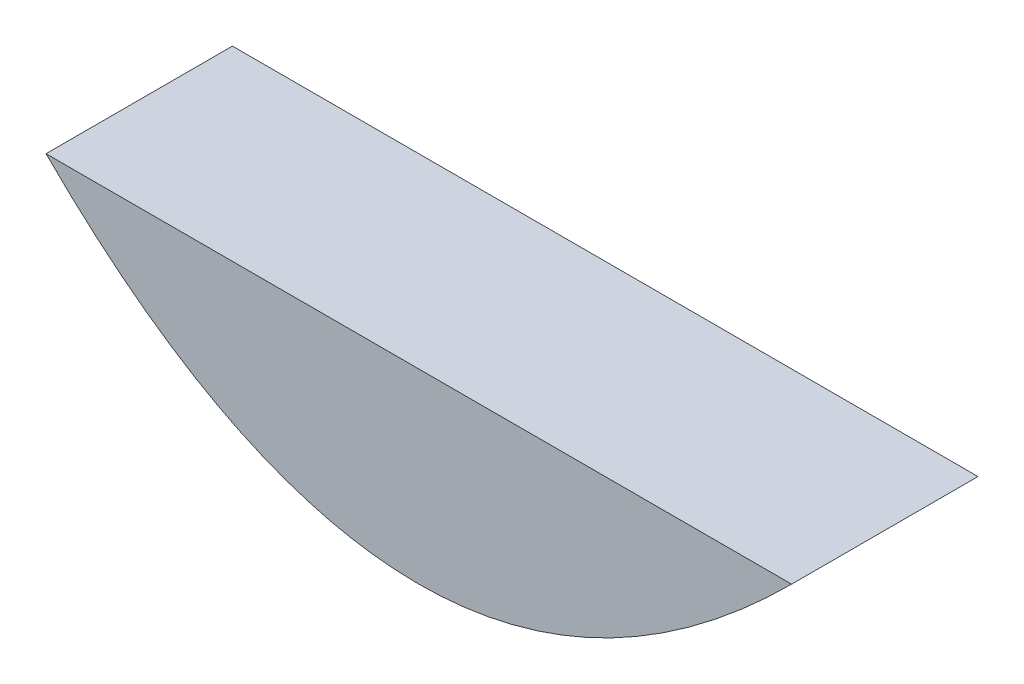
ISO-10303-21;
HEADER;
FILE_DESCRIPTION(('STEP AP214'),'2;1');
FILE_NAME('part.step','',(''),(''),'','','');
FILE_SCHEMA(('AUTOMOTIVE_DESIGN { 1 0 10303 214 1 1 1 1 }'));
ENDSEC;
DATA;
#1=APPLICATION_CONTEXT('core data for automotive mechanical design processes');
#2=APPLICATION_PROTOCOL_DEFINITION('international standard','automotive_design',2000,#1);
#3=PRODUCT_CONTEXT('',#1,'mechanical');
#4=PRODUCT('Part','Part','',(#3));
#5=PRODUCT_RELATED_PRODUCT_CATEGORY('part','',(#4));
#6=PRODUCT_DEFINITION_FORMATION('','',#4);
#7=PRODUCT_DEFINITION_CONTEXT('part definition',#1,'design');
#8=PRODUCT_DEFINITION('design','',#6,#7);
#9=PRODUCT_DEFINITION_SHAPE('','',#8);
#10=(LENGTH_UNIT() NAMED_UNIT(*) SI_UNIT(.MILLI.,.METRE.));
#11=(NAMED_UNIT(*) PLANE_ANGLE_UNIT() SI_UNIT($,.RADIAN.));
#12=(NAMED_UNIT(*) SI_UNIT($,.STERADIAN.) SOLID_ANGLE_UNIT());
#13=UNCERTAINTY_MEASURE_WITH_UNIT(LENGTH_MEASURE(1.E-05),#10,'distance_accuracy_value','');
#14=(GEOMETRIC_REPRESENTATION_CONTEXT(3) GLOBAL_UNCERTAINTY_ASSIGNED_CONTEXT((#13)) GLOBAL_UNIT_ASSIGNED_CONTEXT((#10,
#11,#12)) REPRESENTATION_CONTEXT('',''));
#15=CARTESIAN_POINT('',(0.,0.,0.));
#16=DIRECTION('',(0.,0.,1.));
#17=DIRECTION('',(1.,0.,0.));
#18=AXIS2_PLACEMENT_3D('',#15,#16,#17);
#19=CARTESIAN_POINT('',(-4457.13595499993,1000005.,5.));
#20=CARTESIAN_POINT('',(15.0000000003461,-999995.,5.));
#21=CARTESIAN_POINT('',(4487.13595499923,1000005.,5.));
#22=B_SPLINE_CURVE_WITH_KNOTS('',2,(#19,#20,#21),.UNSPECIFIED.,.F.,.F.,(3,3),(0.,1.),.UNSPECIFIED.);
#23=DIRECTION('',(0.,0.,-1.));
#24=VECTOR('',#23,1.);
#25=SURFACE_OF_LINEAR_EXTRUSION('',#22,#24);
#26=CARTESIAN_POINT('',(-4457.13595499993,1000005.,0.));
#27=CARTESIAN_POINT('',(15.0000000003461,-999995.,0.));
#28=CARTESIAN_POINT('',(4487.13595499923,1000005.,0.));
#29=B_SPLINE_CURVE_WITH_KNOTS('',2,(#26,#27,#28),.UNSPECIFIED.,.F.,.F.,(3,3),(0.,1.),.UNSPECIFIED.);
#30=CARTESIAN_POINT('',(4.99999999999856,10.0000000000247,0.));
#31=VERTEX_POINT('',#30);
#32=CARTESIAN_POINT('',(24.9999999999986,10.0000000000247,0.));
#33=VERTEX_POINT('',#32);
#34=EDGE_CURVE('E65',#31,#33,#29,.T.);
#35=ORIENTED_EDGE('',*,*,#34,.T.);
#36=DIRECTION('',(0.,0.,-1.));
#37=VECTOR('',#36,1.);
#38=CARTESIAN_POINT('',(24.9999999999986,10.0000000000247,5.));
#39=LINE('',#38,#37);
#40=CARTESIAN_POINT('',(24.9999999999986,10.0000000000247,5.));
#41=VERTEX_POINT('',#40);
#42=EDGE_CURVE('E11',#41,#33,#39,.T.);
#43=ORIENTED_EDGE('',*,*,#42,.F.);
#44=CARTESIAN_POINT('',(4.99999999999856,10.0000000000247,5.));
#45=VERTEX_POINT('',#44);
#46=EDGE_CURVE('E64',#45,#41,#22,.T.);
#47=ORIENTED_EDGE('',*,*,#46,.F.);
#48=DIRECTION('',(0.,0.,-1.));
#49=VECTOR('',#48,1.);
#50=CARTESIAN_POINT('',(4.99999999999856,10.0000000000247,5.));
#51=LINE('',#50,#49);
#52=EDGE_CURVE('E42',#45,#31,#51,.T.);
#53=ORIENTED_EDGE('',*,*,#52,.T.);
#54=EDGE_LOOP('',(#35,#43,#47,#53));
#55=FACE_BOUND('',#54,.T.);
#56=ADVANCED_FACE('F33',(#55),#25,.F.);
#57=CARTESIAN_POINT('',(4.99999999999856,10.0000000000247,5.));
#58=DIRECTION('',(0.,-1.,0.));
#59=DIRECTION('',(0.,0.,-1.));
#60=AXIS2_PLACEMENT_3D('',#57,#58,#59);
#61=PLANE('',#60);
#62=DIRECTION('',(-1.,0.,0.));
#63=VECTOR('',#62,1.);
#64=CARTESIAN_POINT('',(4.99999999999856,10.0000000000247,0.));
#65=LINE('',#64,#63);
#66=EDGE_CURVE('E57',#33,#31,#65,.T.);
#67=ORIENTED_EDGE('',*,*,#66,.T.);
#68=ORIENTED_EDGE('',*,*,#52,.F.);
#69=DIRECTION('',(-1.,0.,0.));
#70=VECTOR('',#69,1.);
#71=CARTESIAN_POINT('',(4.99999999999856,10.0000000000247,5.));
#72=LINE('',#71,#70);
#73=EDGE_CURVE('E49',#41,#45,#72,.T.);
#74=ORIENTED_EDGE('',*,*,#73,.F.);
#75=ORIENTED_EDGE('',*,*,#42,.T.);
#76=EDGE_LOOP('',(#67,#68,#74,#75));
#77=FACE_BOUND('',#76,.T.);
#78=ADVANCED_FACE('F60',(#77),#61,.F.);
#79=CARTESIAN_POINT('',(14.9999999999992,5.00000000002387,5.));
#80=DIRECTION('',(0.,0.,-1.));
#81=DIRECTION('',(-1.,0.,0.));
#82=AXIS2_PLACEMENT_3D('',#79,#80,#81);
#83=PLANE('',#82);
#84=ORIENTED_EDGE('',*,*,#46,.T.);
#85=ORIENTED_EDGE('',*,*,#73,.T.);
#86=EDGE_LOOP('',(#84,#85));
#87=FACE_BOUND('',#86,.T.);
#88=ADVANCED_FACE('F82',(#87),#83,.F.);
#89=CARTESIAN_POINT('',(14.9999999999992,5.00000000002387,0.));
#90=DIRECTION('',(0.,0.,-1.));
#91=DIRECTION('',(-1.,0.,0.));
#92=AXIS2_PLACEMENT_3D('',#89,#90,#91);
#93=PLANE('',#92);
#94=ORIENTED_EDGE('',*,*,#34,.F.);
#95=ORIENTED_EDGE('',*,*,#66,.F.);
#96=EDGE_LOOP('',(#94,#95));
#97=FACE_BOUND('',#96,.T.);
#98=ADVANCED_FACE('F68',(#97),#93,.T.);
#99=CLOSED_SHELL('',(#56,#78,#88,#98));
#100=MANIFOLD_SOLID_BREP('B2',#99);
#101=ADVANCED_BREP_SHAPE_REPRESENTATION('',(#18,#100),#14);
#102=SHAPE_DEFINITION_REPRESENTATION(#9,#101);
ENDSEC;
END-ISO-10303-21;
